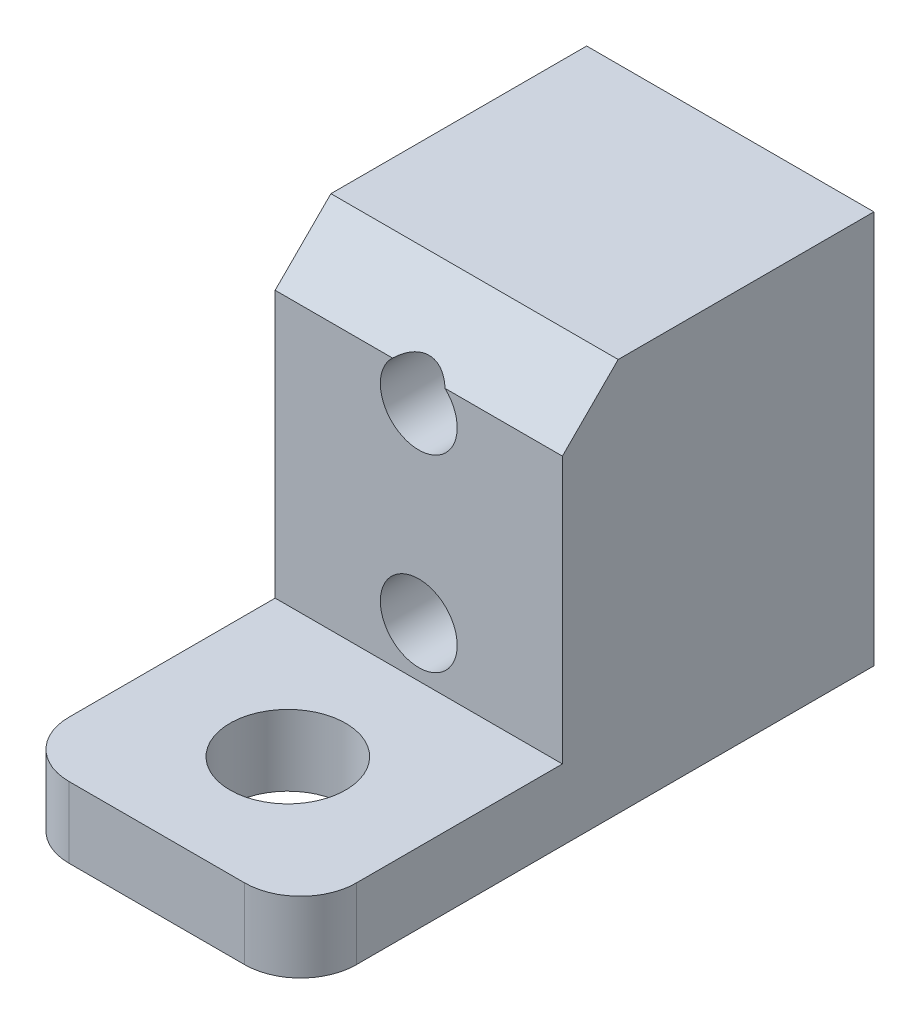
ISO-10303-21;
HEADER;
FILE_DESCRIPTION(('STEP AP214'),'2;1');
FILE_NAME('part.step','',(''),(''),'','','');
FILE_SCHEMA(('AUTOMOTIVE_DESIGN { 1 0 10303 214 1 1 1 1 }'));
ENDSEC;
DATA;
#1=APPLICATION_CONTEXT('core data for automotive mechanical design processes');
#2=APPLICATION_PROTOCOL_DEFINITION('international standard','automotive_design',2000,#1);
#3=PRODUCT_CONTEXT('',#1,'mechanical');
#4=PRODUCT('Part','Part','',(#3));
#5=PRODUCT_RELATED_PRODUCT_CATEGORY('part','',(#4));
#6=PRODUCT_DEFINITION_FORMATION('','',#4);
#7=PRODUCT_DEFINITION_CONTEXT('part definition',#1,'design');
#8=PRODUCT_DEFINITION('design','',#6,#7);
#9=PRODUCT_DEFINITION_SHAPE('','',#8);
#10=(LENGTH_UNIT() NAMED_UNIT(*) SI_UNIT(.MILLI.,.METRE.));
#11=(NAMED_UNIT(*) PLANE_ANGLE_UNIT() SI_UNIT($,.RADIAN.));
#12=(NAMED_UNIT(*) SI_UNIT($,.STERADIAN.) SOLID_ANGLE_UNIT());
#13=UNCERTAINTY_MEASURE_WITH_UNIT(LENGTH_MEASURE(1.E-05),#10,'distance_accuracy_value','');
#14=(GEOMETRIC_REPRESENTATION_CONTEXT(3) GLOBAL_UNCERTAINTY_ASSIGNED_CONTEXT((#13)) GLOBAL_UNIT_ASSIGNED_CONTEXT((#10,
#11,#12)) REPRESENTATION_CONTEXT('',''));
#15=CARTESIAN_POINT('',(0.,0.,0.));
#16=DIRECTION('',(0.,0.,1.));
#17=DIRECTION('',(1.,0.,0.));
#18=AXIS2_PLACEMENT_3D('',#15,#16,#17);
#19=CARTESIAN_POINT('',(0.,0.,14.1859));
#20=DIRECTION('',(0.,0.,-1.));
#21=DIRECTION('',(-1.,0.,0.));
#22=AXIS2_PLACEMENT_3D('',#19,#20,#21);
#23=PLANE('',#22);
#24=CARTESIAN_POINT('',(0.,-3.4466,14.1859));
#25=DIRECTION('',(0.,0.,-1.));
#26=DIRECTION('',(-1.,0.,0.));
#27=AXIS2_PLACEMENT_3D('',#24,#25,#26);
#28=CIRCLE('',#27,1.75);
#29=CARTESIAN_POINT('',(-1.75,-3.4466,14.1859));
#30=VERTEX_POINT('',#29);
#31=EDGE_CURVE('E121',#30,#30,#28,.T.);
#32=ORIENTED_EDGE('',*,*,#31,.T.);
#33=EDGE_LOOP('',(#32));
#34=FACE_BOUND('',#33,.T.);
#35=DIRECTION('',(-1.,0.,0.));
#36=VECTOR('',#35,1.);
#37=CARTESIAN_POINT('',(0.,6.4135,14.1859));
#38=LINE('',#37,#36);
#39=CARTESIAN_POINT('',(6.5405,6.4135,14.1859));
#40=VERTEX_POINT('',#39);
#41=CARTESIAN_POINT('',(1.19324934108509,6.4135,14.1859));
#42=VERTEX_POINT('',#41);
#43=EDGE_CURVE('E120',#40,#42,#38,.T.);
#44=ORIENTED_EDGE('',*,*,#43,.T.);
#45=CARTESIAN_POINT('',(0.,5.1334,14.1859));
#46=DIRECTION('',(0.,0.,-1.));
#47=DIRECTION('',(-1.,0.,0.));
#48=AXIS2_PLACEMENT_3D('',#45,#46,#47);
#49=CIRCLE('',#48,1.75);
#50=CARTESIAN_POINT('',(-1.19324934108509,6.4135,14.1859));
#51=VERTEX_POINT('',#50);
#52=EDGE_CURVE('E50',#42,#51,#49,.T.);
#53=ORIENTED_EDGE('',*,*,#52,.T.);
#54=CARTESIAN_POINT('',(-6.5405,6.4135,14.1859));
#55=VERTEX_POINT('',#54);
#56=EDGE_CURVE('E117',#51,#55,#38,.T.);
#57=ORIENTED_EDGE('',*,*,#56,.T.);
#58=DIRECTION('',(0.,-1.,0.));
#59=VECTOR('',#58,1.);
#60=CARTESIAN_POINT('',(-6.5405,-8.9535,14.1859));
#61=LINE('',#60,#59);
#62=CARTESIAN_POINT('',(-6.5405,-5.7277,14.1859));
#63=VERTEX_POINT('',#62);
#64=EDGE_CURVE('E192',#55,#63,#61,.T.);
#65=ORIENTED_EDGE('',*,*,#64,.T.);
#66=DIRECTION('',(-1.,0.,0.));
#67=VECTOR('',#66,1.);
#68=CARTESIAN_POINT('',(-6.5405,-5.7277,14.1859));
#69=LINE('',#68,#67);
#70=CARTESIAN_POINT('',(6.5405,-5.7277,14.1859));
#71=VERTEX_POINT('',#70);
#72=EDGE_CURVE('E168',#71,#63,#69,.T.);
#73=ORIENTED_EDGE('',*,*,#72,.F.);
#74=DIRECTION('',(0.,1.,0.));
#75=VECTOR('',#74,1.);
#76=CARTESIAN_POINT('',(6.5405,-8.9535,14.1859));
#77=LINE('',#76,#75);
#78=EDGE_CURVE('E190',#71,#40,#77,.T.);
#79=ORIENTED_EDGE('',*,*,#78,.T.);
#80=EDGE_LOOP('',(#44,#53,#57,#65,#73,#79));
#81=FACE_BOUND('',#80,.T.);
#82=ADVANCED_FACE('F37',(#34,#81),#23,.F.);
#83=CARTESIAN_POINT('',(6.5405,-8.9535,14.1859));
#84=DIRECTION('',(-1.,0.,0.));
#85=DIRECTION('',(0.,0.,1.));
#86=AXIS2_PLACEMENT_3D('',#83,#84,#85);
#87=PLANE('',#86);
#88=DIRECTION('',(0.,0.,-1.));
#89=VECTOR('',#88,1.);
#90=CARTESIAN_POINT('',(6.5405,-5.7277,26.1112));
#91=LINE('',#90,#89);
#92=CARTESIAN_POINT('',(6.5405,-5.7277,23.5712));
#93=VERTEX_POINT('',#92);
#94=EDGE_CURVE('E169',#93,#71,#91,.T.);
#95=ORIENTED_EDGE('',*,*,#94,.F.);
#96=DIRECTION('',(0.,1.,0.));
#97=VECTOR('',#96,1.);
#98=CARTESIAN_POINT('',(6.5405,-8.9535,23.5712));
#99=LINE('',#98,#97);
#100=CARTESIAN_POINT('',(6.5405,-8.9535,23.5712));
#101=VERTEX_POINT('',#100);
#102=EDGE_CURVE('E149',#93,#101,#99,.F.);
#103=ORIENTED_EDGE('',*,*,#102,.T.);
#104=DIRECTION('',(0.,0.,-1.));
#105=VECTOR('',#104,1.);
#106=CARTESIAN_POINT('',(6.5405,-8.9535,14.1859));
#107=LINE('',#106,#105);
#108=CARTESIAN_POINT('',(6.5405,-8.9535,0.));
#109=VERTEX_POINT('',#108);
#110=EDGE_CURVE('E195',#101,#109,#107,.T.);
#111=ORIENTED_EDGE('',*,*,#110,.T.);
#112=DIRECTION('',(0.,1.,0.));
#113=VECTOR('',#112,1.);
#114=CARTESIAN_POINT('',(6.5405,-8.9535,0.));
#115=LINE('',#114,#113);
#116=CARTESIAN_POINT('',(6.5405,8.9535,0.));
#117=VERTEX_POINT('',#116);
#118=EDGE_CURVE('E189',#109,#117,#115,.T.);
#119=ORIENTED_EDGE('',*,*,#118,.T.);
#120=DIRECTION('',(0.,0.,-1.));
#121=VECTOR('',#120,1.);
#122=CARTESIAN_POINT('',(6.5405,8.9535,14.1859));
#123=LINE('',#122,#121);
#124=CARTESIAN_POINT('',(6.5405,8.9535,11.6459));
#125=VERTEX_POINT('',#124);
#126=EDGE_CURVE('E128',#125,#117,#123,.T.);
#127=ORIENTED_EDGE('',*,*,#126,.F.);
#128=DIRECTION('',(0.,0.707106781186547,-0.707106781186549));
#129=VECTOR('',#128,1.);
#130=CARTESIAN_POINT('',(6.5405,6.4135,14.1859));
#131=LINE('',#130,#129);
#132=EDGE_CURVE('E137',#125,#40,#131,.F.);
#133=ORIENTED_EDGE('',*,*,#132,.T.);
#134=ORIENTED_EDGE('',*,*,#78,.F.);
#135=EDGE_LOOP('',(#95,#103,#111,#119,#127,#133,#134));
#136=FACE_BOUND('',#135,.T.);
#137=ADVANCED_FACE('F222',(#136),#87,.F.);
#138=CARTESIAN_POINT('',(-6.5405,8.9535,14.1859));
#139=DIRECTION('',(0.,-1.,0.));
#140=DIRECTION('',(0.,0.,-1.));
#141=AXIS2_PLACEMENT_3D('',#138,#139,#140);
#142=PLANE('',#141);
#143=DIRECTION('',(0.,0.,-1.));
#144=VECTOR('',#143,1.);
#145=CARTESIAN_POINT('',(-6.5405,8.9535,14.1859));
#146=LINE('',#145,#144);
#147=CARTESIAN_POINT('',(-6.5405,8.9535,11.6459));
#148=VERTEX_POINT('',#147);
#149=CARTESIAN_POINT('',(-6.5405,8.9535,0.));
#150=VERTEX_POINT('',#149);
#151=EDGE_CURVE('E130',#148,#150,#146,.T.);
#152=ORIENTED_EDGE('',*,*,#151,.F.);
#153=DIRECTION('',(1.,0.,0.));
#154=VECTOR('',#153,1.);
#155=CARTESIAN_POINT('',(-6.5405,8.9535,11.6459));
#156=LINE('',#155,#154);
#157=EDGE_CURVE('E135',#148,#125,#156,.T.);
#158=ORIENTED_EDGE('',*,*,#157,.T.);
#159=ORIENTED_EDGE('',*,*,#126,.T.);
#160=DIRECTION('',(-1.,0.,0.));
#161=VECTOR('',#160,1.);
#162=CARTESIAN_POINT('',(-6.5405,8.9535,0.));
#163=LINE('',#162,#161);
#164=EDGE_CURVE('E198',#117,#150,#163,.T.);
#165=ORIENTED_EDGE('',*,*,#164,.T.);
#166=EDGE_LOOP('',(#152,#158,#159,#165));
#167=FACE_BOUND('',#166,.T.);
#168=ADVANCED_FACE('F211',(#167),#142,.F.);
#169=CARTESIAN_POINT('',(-6.5405,-8.9535,14.1859));
#170=DIRECTION('',(1.,0.,0.));
#171=DIRECTION('',(0.,0.,-1.));
#172=AXIS2_PLACEMENT_3D('',#169,#170,#171);
#173=PLANE('',#172);
#174=DIRECTION('',(0.,0.,-1.));
#175=VECTOR('',#174,1.);
#176=CARTESIAN_POINT('',(-6.5405,-8.9535,14.1859));
#177=LINE('',#176,#175);
#178=CARTESIAN_POINT('',(-6.5405,-8.9535,23.5712));
#179=VERTEX_POINT('',#178);
#180=CARTESIAN_POINT('',(-6.5405,-8.9535,0.));
#181=VERTEX_POINT('',#180);
#182=EDGE_CURVE('E159',#179,#181,#177,.T.);
#183=ORIENTED_EDGE('',*,*,#182,.F.);
#184=DIRECTION('',(0.,-1.,0.));
#185=VECTOR('',#184,1.);
#186=CARTESIAN_POINT('',(-6.5405,-8.9535,23.5712));
#187=LINE('',#186,#185);
#188=CARTESIAN_POINT('',(-6.5405,-5.7277,23.5712));
#189=VERTEX_POINT('',#188);
#190=EDGE_CURVE('E45',#179,#189,#187,.F.);
#191=ORIENTED_EDGE('',*,*,#190,.T.);
#192=DIRECTION('',(0.,0.,-1.));
#193=VECTOR('',#192,1.);
#194=CARTESIAN_POINT('',(-6.5405,-5.7277,26.1112));
#195=LINE('',#194,#193);
#196=EDGE_CURVE('E157',#189,#63,#195,.T.);
#197=ORIENTED_EDGE('',*,*,#196,.T.);
#198=ORIENTED_EDGE('',*,*,#64,.F.);
#199=DIRECTION('',(0.,-0.707106781186547,0.707106781186549));
#200=VECTOR('',#199,1.);
#201=CARTESIAN_POINT('',(-6.5405,6.4135,14.1859));
#202=LINE('',#201,#200);
#203=EDGE_CURVE('E126',#55,#148,#202,.F.);
#204=ORIENTED_EDGE('',*,*,#203,.T.);
#205=ORIENTED_EDGE('',*,*,#151,.T.);
#206=DIRECTION('',(0.,-1.,0.));
#207=VECTOR('',#206,1.);
#208=CARTESIAN_POINT('',(-6.5405,-8.9535,0.));
#209=LINE('',#208,#207);
#210=EDGE_CURVE('E201',#150,#181,#209,.T.);
#211=ORIENTED_EDGE('',*,*,#210,.T.);
#212=EDGE_LOOP('',(#183,#191,#197,#198,#204,#205,#211));
#213=FACE_BOUND('',#212,.T.);
#214=ADVANCED_FACE('F156',(#213),#173,.F.);
#215=CARTESIAN_POINT('',(-6.5405,-8.9535,14.1859));
#216=DIRECTION('',(0.,1.,0.));
#217=DIRECTION('',(0.,0.,1.));
#218=AXIS2_PLACEMENT_3D('',#215,#216,#217);
#219=PLANE('',#218);
#220=CARTESIAN_POINT('',(0.,-8.9535,20.14855));
#221=DIRECTION('',(0.,1.,0.));
#222=DIRECTION('',(0.,0.,1.));
#223=AXIS2_PLACEMENT_3D('',#220,#221,#222);
#224=CIRCLE('',#223,2.63525);
#225=CARTESIAN_POINT('',(0.,-8.9535,22.7838));
#226=VERTEX_POINT('',#225);
#227=EDGE_CURVE('E183',#226,#226,#224,.F.);
#228=ORIENTED_EDGE('',*,*,#227,.F.);
#229=EDGE_LOOP('',(#228));
#230=FACE_BOUND('',#229,.T.);
#231=ORIENTED_EDGE('',*,*,#110,.F.);
#232=CARTESIAN_POINT('',(4.0005,-8.9535,23.5712));
#233=DIRECTION('',(0.,1.,0.));
#234=DIRECTION('',(0.,0.,1.));
#235=AXIS2_PLACEMENT_3D('',#232,#233,#234);
#236=CIRCLE('',#235,2.54);
#237=CARTESIAN_POINT('',(4.0005,-8.9535,26.1112));
#238=VERTEX_POINT('',#237);
#239=EDGE_CURVE('E152',#101,#238,#236,.F.);
#240=ORIENTED_EDGE('',*,*,#239,.T.);
#241=DIRECTION('',(1.,0.,0.));
#242=VECTOR('',#241,1.);
#243=CARTESIAN_POINT('',(-6.5405,-8.9535,26.1112));
#244=LINE('',#243,#242);
#245=CARTESIAN_POINT('',(-4.0005,-8.9535,26.1112));
#246=VERTEX_POINT('',#245);
#247=EDGE_CURVE('E176',#246,#238,#244,.T.);
#248=ORIENTED_EDGE('',*,*,#247,.F.);
#249=CARTESIAN_POINT('',(-4.0005,-8.9535,23.5712));
#250=DIRECTION('',(0.,1.,0.));
#251=DIRECTION('',(0.,0.,1.));
#252=AXIS2_PLACEMENT_3D('',#249,#250,#251);
#253=CIRCLE('',#252,2.54);
#254=EDGE_CURVE('E58',#246,#179,#253,.F.);
#255=ORIENTED_EDGE('',*,*,#254,.T.);
#256=ORIENTED_EDGE('',*,*,#182,.T.);
#257=DIRECTION('',(1.,0.,0.));
#258=VECTOR('',#257,1.);
#259=CARTESIAN_POINT('',(-6.5405,-8.9535,0.));
#260=LINE('',#259,#258);
#261=EDGE_CURVE('E193',#181,#109,#260,.T.);
#262=ORIENTED_EDGE('',*,*,#261,.T.);
#263=EDGE_LOOP('',(#231,#240,#248,#255,#256,#262));
#264=FACE_BOUND('',#263,.T.);
#265=ADVANCED_FACE('F179',(#230,#264),#219,.F.);
#266=CARTESIAN_POINT('',(0.,0.,0.));
#267=DIRECTION('',(0.,0.,-1.));
#268=DIRECTION('',(-1.,0.,0.));
#269=AXIS2_PLACEMENT_3D('',#266,#267,#268);
#270=PLANE('',#269);
#271=CARTESIAN_POINT('',(0.,-3.4466,0.));
#272=DIRECTION('',(0.,0.,-1.));
#273=DIRECTION('',(-1.,0.,0.));
#274=AXIS2_PLACEMENT_3D('',#271,#272,#273);
#275=CIRCLE('',#274,1.75);
#276=CARTESIAN_POINT('',(-1.75,-3.4466,0.));
#277=VERTEX_POINT('',#276);
#278=EDGE_CURVE('E122',#277,#277,#275,.T.);
#279=ORIENTED_EDGE('',*,*,#278,.F.);
#280=EDGE_LOOP('',(#279));
#281=FACE_BOUND('',#280,.T.);
#282=CARTESIAN_POINT('',(0.,5.1334,0.));
#283=DIRECTION('',(0.,0.,-1.));
#284=DIRECTION('',(-1.,0.,0.));
#285=AXIS2_PLACEMENT_3D('',#282,#283,#284);
#286=CIRCLE('',#285,1.75);
#287=CARTESIAN_POINT('',(-1.75,5.1334,0.));
#288=VERTEX_POINT('',#287);
#289=EDGE_CURVE('E324',#288,#288,#286,.T.);
#290=ORIENTED_EDGE('',*,*,#289,.F.);
#291=EDGE_LOOP('',(#290));
#292=FACE_BOUND('',#291,.T.);
#293=ORIENTED_EDGE('',*,*,#118,.F.);
#294=ORIENTED_EDGE('',*,*,#261,.F.);
#295=ORIENTED_EDGE('',*,*,#210,.F.);
#296=ORIENTED_EDGE('',*,*,#164,.F.);
#297=EDGE_LOOP('',(#293,#294,#295,#296));
#298=FACE_BOUND('',#297,.T.);
#299=ADVANCED_FACE('F215',(#281,#292,#298),#270,.T.);
#300=CARTESIAN_POINT('',(-6.5405,-5.7277,26.1112));
#301=DIRECTION('',(0.,-1.,0.));
#302=DIRECTION('',(0.,0.,-1.));
#303=AXIS2_PLACEMENT_3D('',#300,#301,#302);
#304=PLANE('',#303);
#305=CARTESIAN_POINT('',(0.,-5.7277,20.14855));
#306=DIRECTION('',(0.,1.,0.));
#307=DIRECTION('',(0.,0.,1.));
#308=AXIS2_PLACEMENT_3D('',#305,#306,#307);
#309=CIRCLE('',#308,2.63525);
#310=CARTESIAN_POINT('',(0.,-5.7277,22.7838));
#311=VERTEX_POINT('',#310);
#312=EDGE_CURVE('E320',#311,#311,#309,.T.);
#313=ORIENTED_EDGE('',*,*,#312,.F.);
#314=EDGE_LOOP('',(#313));
#315=FACE_BOUND('',#314,.T.);
#316=DIRECTION('',(-1.,0.,0.));
#317=VECTOR('',#316,1.);
#318=CARTESIAN_POINT('',(-6.5405,-5.7277,26.1112));
#319=LINE('',#318,#317);
#320=CARTESIAN_POINT('',(4.0005,-5.7277,26.1112));
#321=VERTEX_POINT('',#320);
#322=CARTESIAN_POINT('',(-4.0005,-5.7277,26.1112));
#323=VERTEX_POINT('',#322);
#324=EDGE_CURVE('E170',#321,#323,#319,.T.);
#325=ORIENTED_EDGE('',*,*,#324,.F.);
#326=CARTESIAN_POINT('',(4.0005,-5.7277,23.5712));
#327=DIRECTION('',(0.,-1.,0.));
#328=DIRECTION('',(0.,0.,-1.));
#329=AXIS2_PLACEMENT_3D('',#326,#327,#328);
#330=CIRCLE('',#329,2.54);
#331=EDGE_CURVE('E147',#321,#93,#330,.F.);
#332=ORIENTED_EDGE('',*,*,#331,.T.);
#333=ORIENTED_EDGE('',*,*,#94,.T.);
#334=ORIENTED_EDGE('',*,*,#72,.T.);
#335=ORIENTED_EDGE('',*,*,#196,.F.);
#336=CARTESIAN_POINT('',(-4.0005,-5.7277,23.5712));
#337=DIRECTION('',(0.,-1.,0.));
#338=DIRECTION('',(0.,0.,-1.));
#339=AXIS2_PLACEMENT_3D('',#336,#337,#338);
#340=CIRCLE('',#339,2.54);
#341=EDGE_CURVE('E145',#189,#323,#340,.F.);
#342=ORIENTED_EDGE('',*,*,#341,.T.);
#343=EDGE_LOOP('',(#325,#332,#333,#334,#335,#342));
#344=FACE_BOUND('',#343,.T.);
#345=ADVANCED_FACE('F165',(#315,#344),#304,.F.);
#346=CARTESIAN_POINT('',(0.,0.,26.1112));
#347=DIRECTION('',(0.,0.,-1.));
#348=DIRECTION('',(-1.,0.,0.));
#349=AXIS2_PLACEMENT_3D('',#346,#347,#348);
#350=PLANE('',#349);
#351=ORIENTED_EDGE('',*,*,#247,.T.);
#352=DIRECTION('',(0.,1.,0.));
#353=VECTOR('',#352,1.);
#354=CARTESIAN_POINT('',(4.0005,0.,26.1112));
#355=LINE('',#354,#353);
#356=EDGE_CURVE('E142',#238,#321,#355,.T.);
#357=ORIENTED_EDGE('',*,*,#356,.T.);
#358=ORIENTED_EDGE('',*,*,#324,.T.);
#359=DIRECTION('',(0.,-1.,0.));
#360=VECTOR('',#359,1.);
#361=CARTESIAN_POINT('',(-4.0005,0.,26.1112));
#362=LINE('',#361,#360);
#363=EDGE_CURVE('E139',#323,#246,#362,.T.);
#364=ORIENTED_EDGE('',*,*,#363,.T.);
#365=EDGE_LOOP('',(#351,#357,#358,#364));
#366=FACE_BOUND('',#365,.T.);
#367=ADVANCED_FACE('F175',(#366),#350,.F.);
#368=CARTESIAN_POINT('',(0.,6.4135,14.1859));
#369=DIRECTION('',(0.,-0.707106781186549,-0.707106781186547));
#370=DIRECTION('',(-1.,0.,0.));
#371=AXIS2_PLACEMENT_3D('',#368,#369,#370);
#372=PLANE('',#371);
#373=CARTESIAN_POINT('',(0.,5.1334,15.466));
#374=DIRECTION('',(0.,-0.707106781186549,-0.707106781186547));
#375=DIRECTION('',(0.,0.707106781186547,-0.707106781186549));
#376=AXIS2_PLACEMENT_3D('',#373,#374,#375);
#377=ELLIPSE('',#376,2.47487373415292,1.75);
#378=EDGE_CURVE('E11',#42,#51,#377,.F.);
#379=ORIENTED_EDGE('',*,*,#378,.F.);
#380=ORIENTED_EDGE('',*,*,#43,.F.);
#381=ORIENTED_EDGE('',*,*,#132,.F.);
#382=ORIENTED_EDGE('',*,*,#157,.F.);
#383=ORIENTED_EDGE('',*,*,#203,.F.);
#384=ORIENTED_EDGE('',*,*,#56,.F.);
#385=EDGE_LOOP('',(#379,#380,#381,#382,#383,#384));
#386=FACE_BOUND('',#385,.T.);
#387=ADVANCED_FACE('F124',(#386),#372,.F.);
#388=CARTESIAN_POINT('',(4.0005,0.,23.5712));
#389=DIRECTION('',(0.,1.,0.));
#390=DIRECTION('',(0.,0.,1.));
#391=AXIS2_PLACEMENT_3D('',#388,#389,#390);
#392=CYLINDRICAL_SURFACE('',#391,2.54);
#393=ORIENTED_EDGE('',*,*,#239,.F.);
#394=ORIENTED_EDGE('',*,*,#102,.F.);
#395=ORIENTED_EDGE('',*,*,#331,.F.);
#396=ORIENTED_EDGE('',*,*,#356,.F.);
#397=EDGE_LOOP('',(#393,#394,#395,#396));
#398=FACE_BOUND('',#397,.T.);
#399=ADVANCED_FACE('F219',(#398),#392,.T.);
#400=CARTESIAN_POINT('',(-4.0005,0.,23.5712));
#401=DIRECTION('',(0.,-1.,0.));
#402=DIRECTION('',(0.,0.,-1.));
#403=AXIS2_PLACEMENT_3D('',#400,#401,#402);
#404=CYLINDRICAL_SURFACE('',#403,2.54);
#405=ORIENTED_EDGE('',*,*,#341,.F.);
#406=ORIENTED_EDGE('',*,*,#190,.F.);
#407=ORIENTED_EDGE('',*,*,#254,.F.);
#408=ORIENTED_EDGE('',*,*,#363,.F.);
#409=EDGE_LOOP('',(#405,#406,#407,#408));
#410=FACE_BOUND('',#409,.T.);
#411=ADVANCED_FACE('F39',(#410),#404,.T.);
#412=CARTESIAN_POINT('',(0.,-16.4071125804874,20.14855));
#413=DIRECTION('',(0.,1.,0.));
#414=DIRECTION('',(0.,0.,1.));
#415=AXIS2_PLACEMENT_3D('',#412,#413,#414);
#416=CYLINDRICAL_SURFACE('',#415,2.63525);
#417=ORIENTED_EDGE('',*,*,#227,.T.);
#418=EDGE_LOOP('',(#417));
#419=FACE_BOUND('',#418,.T.);
#420=ORIENTED_EDGE('',*,*,#312,.T.);
#421=EDGE_LOOP('',(#420));
#422=FACE_BOUND('',#421,.T.);
#423=ADVANCED_FACE('F243',(#419,#422),#416,.F.);
#424=CARTESIAN_POINT('',(0.,5.1334,26.1112));
#425=DIRECTION('',(0.,0.,-1.));
#426=DIRECTION('',(-1.,0.,0.));
#427=AXIS2_PLACEMENT_3D('',#424,#425,#426);
#428=CYLINDRICAL_SURFACE('',#427,1.75);
#429=ORIENTED_EDGE('',*,*,#289,.T.);
#430=EDGE_LOOP('',(#429));
#431=FACE_BOUND('',#430,.T.);
#432=ORIENTED_EDGE('',*,*,#378,.T.);
#433=ORIENTED_EDGE('',*,*,#52,.F.);
#434=EDGE_LOOP('',(#432,#433));
#435=FACE_BOUND('',#434,.T.);
#436=ADVANCED_FACE('F110',(#431,#435),#428,.F.);
#437=CARTESIAN_POINT('',(0.,-3.4466,26.1112));
#438=DIRECTION('',(0.,0.,-1.));
#439=DIRECTION('',(-1.,0.,0.));
#440=AXIS2_PLACEMENT_3D('',#437,#438,#439);
#441=CYLINDRICAL_SURFACE('',#440,1.75);
#442=CARTESIAN_POINT('',(-1.75,-3.4466,0.));
#443=CARTESIAN_POINT('',(-1.75,-3.4466,0.14776979166667));
#444=CARTESIAN_POINT('',(-1.75,-3.4466,0.295539583333336));
#445=CARTESIAN_POINT('',(-1.75,-3.4466,0.591079166666669));
#446=CARTESIAN_POINT('',(-1.75,-3.4466,0.738848958333335));
#447=CARTESIAN_POINT('',(-1.75,-3.4466,1.03438854166667));
#448=CARTESIAN_POINT('',(-1.75,-3.4466,1.18215833333334));
#449=CARTESIAN_POINT('',(-1.75,-3.4466,1.47769791666667));
#450=CARTESIAN_POINT('',(-1.75,-3.4466,1.62546770833334));
#451=CARTESIAN_POINT('',(-1.75,-3.4466,1.92100729166667));
#452=CARTESIAN_POINT('',(-1.75,-3.4466,2.06877708333334));
#453=CARTESIAN_POINT('',(-1.75,-3.4466,2.36431666666667));
#454=CARTESIAN_POINT('',(-1.75,-3.4466,2.51208645833334));
#455=CARTESIAN_POINT('',(-1.75,-3.4466,2.80762604166667));
#456=CARTESIAN_POINT('',(-1.75,-3.4466,2.95539583333334));
#457=CARTESIAN_POINT('',(-1.75,-3.4466,3.25093541666667));
#458=CARTESIAN_POINT('',(-1.75,-3.4466,3.39870520833334));
#459=CARTESIAN_POINT('',(-1.75,-3.4466,3.69424479166667));
#460=CARTESIAN_POINT('',(-1.75,-3.4466,3.84201458333334));
#461=CARTESIAN_POINT('',(-1.75,-3.4466,4.13755416666667));
#462=CARTESIAN_POINT('',(-1.75,-3.4466,4.28532395833334));
#463=CARTESIAN_POINT('',(-1.75,-3.4466,4.58086354166667));
#464=CARTESIAN_POINT('',(-1.75,-3.4466,4.72863333333334));
#465=CARTESIAN_POINT('',(-1.75,-3.4466,5.02417291666667));
#466=CARTESIAN_POINT('',(-1.75,-3.4466,5.17194270833333));
#467=CARTESIAN_POINT('',(-1.75,-3.4466,5.46748229166667));
#468=CARTESIAN_POINT('',(-1.75,-3.4466,5.61525208333334));
#469=CARTESIAN_POINT('',(-1.75,-3.4466,5.91079166666667));
#470=CARTESIAN_POINT('',(-1.75,-3.4466,6.05856145833334));
#471=CARTESIAN_POINT('',(-1.75,-3.4466,6.35410104166667));
#472=CARTESIAN_POINT('',(-1.75,-3.4466,6.50187083333334));
#473=CARTESIAN_POINT('',(-1.75,-3.4466,6.79741041666667));
#474=CARTESIAN_POINT('',(-1.75,-3.4466,6.94518020833334));
#475=CARTESIAN_POINT('',(-1.75,-3.4466,7.24071979166667));
#476=CARTESIAN_POINT('',(-1.75,-3.4466,7.38848958333334));
#477=CARTESIAN_POINT('',(-1.75,-3.4466,7.68402916666667));
#478=CARTESIAN_POINT('',(-1.75,-3.4466,7.83179895833334));
#479=CARTESIAN_POINT('',(-1.75,-3.4466,8.12733854166667));
#480=CARTESIAN_POINT('',(-1.75,-3.4466,8.27510833333334));
#481=CARTESIAN_POINT('',(-1.75,-3.4466,8.57064791666667));
#482=CARTESIAN_POINT('',(-1.75,-3.4466,8.71841770833333));
#483=CARTESIAN_POINT('',(-1.75,-3.4466,9.01395729166667));
#484=CARTESIAN_POINT('',(-1.75,-3.4466,9.16172708333333));
#485=CARTESIAN_POINT('',(-1.75,-3.4466,9.45726666666667));
#486=CARTESIAN_POINT('',(-1.75,-3.4466,9.60503645833334));
#487=CARTESIAN_POINT('',(-1.75,-3.4466,9.90057604166667));
#488=CARTESIAN_POINT('',(-1.75,-3.4466,10.0483458333333));
#489=CARTESIAN_POINT('',(-1.75,-3.4466,10.3438854166667));
#490=CARTESIAN_POINT('',(-1.75,-3.4466,10.4916552083333));
#491=CARTESIAN_POINT('',(-1.75,-3.4466,10.7871947916667));
#492=CARTESIAN_POINT('',(-1.75,-3.4466,10.9349645833333));
#493=CARTESIAN_POINT('',(-1.75,-3.4466,11.2305041666667));
#494=CARTESIAN_POINT('',(-1.75,-3.4466,11.3782739583333));
#495=CARTESIAN_POINT('',(-1.75,-3.4466,11.6738135416667));
#496=CARTESIAN_POINT('',(-1.75,-3.4466,11.8215833333333));
#497=CARTESIAN_POINT('',(-1.75,-3.4466,12.1171229166667));
#498=CARTESIAN_POINT('',(-1.75,-3.4466,12.2648927083333));
#499=CARTESIAN_POINT('',(-1.75,-3.4466,12.5604322916667));
#500=CARTESIAN_POINT('',(-1.75,-3.4466,12.7082020833333));
#501=CARTESIAN_POINT('',(-1.75,-3.4466,13.0037416666667));
#502=CARTESIAN_POINT('',(-1.75,-3.4466,13.1515114583333));
#503=CARTESIAN_POINT('',(-1.75,-3.4466,13.4470510416667));
#504=CARTESIAN_POINT('',(-1.75,-3.4466,13.5948208333333));
#505=CARTESIAN_POINT('',(-1.75,-3.4466,13.8903604166667));
#506=CARTESIAN_POINT('',(-1.75,-3.4466,14.0381302083333));
#507=CARTESIAN_POINT('',(-1.75,-3.4466,14.1859));
#508=B_SPLINE_CURVE_WITH_KNOTS('',3,(#442,#443,#444,#445,#446,#447,#448,#449,#450,#451,#452,
#453,#454,#455,#456,#457,#458,#459,#460,#461,#462,#463,#464,#465,#466,#467,#468,#469,#470,#471,
#472,#473,#474,#475,#476,#477,#478,#479,#480,#481,#482,#483,#484,#485,#486,#487,#488,#489,#490,
#491,#492,#493,#494,#495,#496,#497,#498,#499,#500,#501,#502,#503,#504,#505,#506,#507),
.UNSPECIFIED.,.F.,.F.,(4,2,2,2,2,2,2,2,2,2,2,2,2,2,2,2,2,2,2,2,2,2,2,2,2,2,2,2,2,2,2,2,4),(0.,
0.443309374999999,0.886618749999998,1.329928125,1.7732375,2.216546875,2.65985625,3.103165625,
3.546475,3.989784375,4.43309375,4.876403125,5.3197125,5.763021875,6.20633125,6.649640625,
7.09295,7.536259375,7.97956875,8.422878125,8.8661875,9.309496875,9.75280625,10.196115625,
10.639425,11.082734375,11.52604375,11.969353125,12.4126625,12.855971875,13.29928125,
13.742590625,14.1859),.UNSPECIFIED.);
#509=EDGE_CURVE('BSEAM252',#277,#30,#508,.T.);
#510=ORIENTED_EDGE('',*,*,#278,.T.);
#511=ORIENTED_EDGE('',*,*,#31,.F.);
#512=ORIENTED_EDGE('',*,*,#509,.T.);
#513=ORIENTED_EDGE('',*,*,#509,.F.);
#514=EDGE_LOOP('',(#510,#512,#511,#513));
#515=FACE_BOUND('',#514,.T.);
#516=ADVANCED_FACE('F252',(#515),#441,.F.);
#517=CLOSED_SHELL('',(#82,#137,#168,#214,#265,#299,#345,#367,#387,#399,#411,#423,#436,#516));
#518=MANIFOLD_SOLID_BREP('B2',#517);
#519=ADVANCED_BREP_SHAPE_REPRESENTATION('',(#18,#518),#14);
#520=SHAPE_DEFINITION_REPRESENTATION(#9,#519);
ENDSEC;
END-ISO-10303-21;
